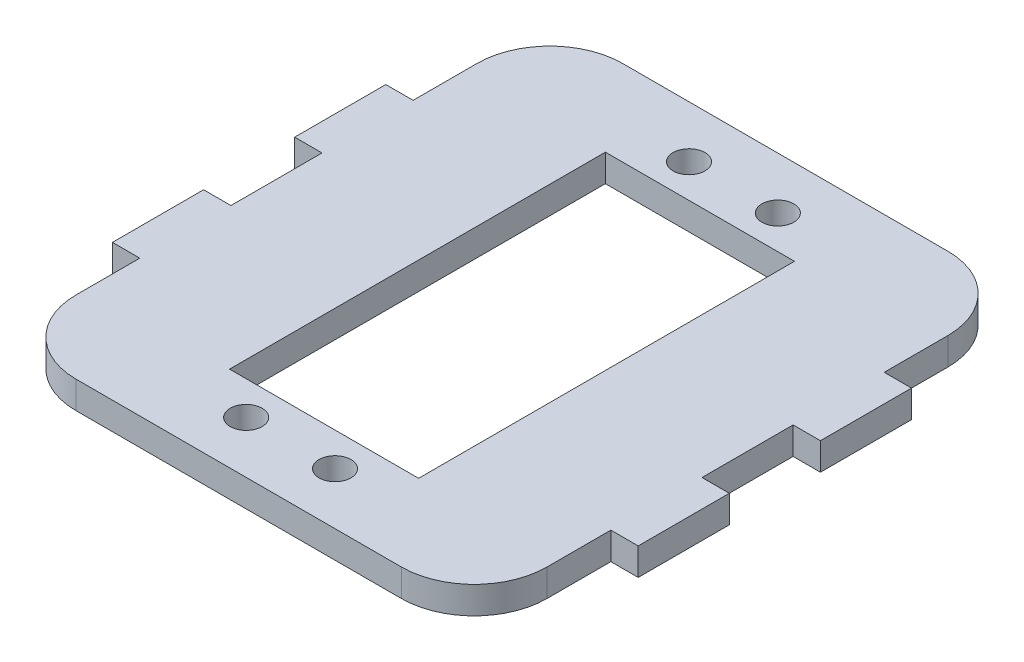
ISO-10303-21;
HEADER;
FILE_DESCRIPTION(('STEP AP214'),'2;1');
FILE_NAME('part.step','',(''),(''),'','','');
FILE_SCHEMA(('AUTOMOTIVE_DESIGN { 1 0 10303 214 1 1 1 1 }'));
ENDSEC;
DATA;
#1=APPLICATION_CONTEXT('core data for automotive mechanical design processes');
#2=APPLICATION_PROTOCOL_DEFINITION('international standard','automotive_design',2000,#1);
#3=PRODUCT_CONTEXT('',#1,'mechanical');
#4=PRODUCT('Part','Part','',(#3));
#5=PRODUCT_RELATED_PRODUCT_CATEGORY('part','',(#4));
#6=PRODUCT_DEFINITION_FORMATION('','',#4);
#7=PRODUCT_DEFINITION_CONTEXT('part definition',#1,'design');
#8=PRODUCT_DEFINITION('design','',#6,#7);
#9=PRODUCT_DEFINITION_SHAPE('','',#8);
#10=(LENGTH_UNIT() NAMED_UNIT(*) SI_UNIT(.MILLI.,.METRE.));
#11=(NAMED_UNIT(*) PLANE_ANGLE_UNIT() SI_UNIT($,.RADIAN.));
#12=(NAMED_UNIT(*) SI_UNIT($,.STERADIAN.) SOLID_ANGLE_UNIT());
#13=UNCERTAINTY_MEASURE_WITH_UNIT(LENGTH_MEASURE(1.E-05),#10,'distance_accuracy_value','');
#14=(GEOMETRIC_REPRESENTATION_CONTEXT(3) GLOBAL_UNCERTAINTY_ASSIGNED_CONTEXT((#13)) GLOBAL_UNIT_ASSIGNED_CONTEXT((#10,
#11,#12)) REPRESENTATION_CONTEXT('',''));
#15=CARTESIAN_POINT('',(0.,0.,0.));
#16=DIRECTION('',(0.,0.,1.));
#17=DIRECTION('',(1.,0.,0.));
#18=AXIS2_PLACEMENT_3D('',#15,#16,#17);
#19=CARTESIAN_POINT('',(0.,3.,0.));
#20=DIRECTION('',(0.,1.,0.));
#21=DIRECTION('',(0.,0.,1.));
#22=AXIS2_PLACEMENT_3D('',#19,#20,#21);
#23=PLANE('',#22);
#24=CARTESIAN_POINT('',(4.87500000000017,3.,-24.3));
#25=DIRECTION('',(0.,1.,0.));
#26=DIRECTION('',(0.,0.,1.));
#27=AXIS2_PLACEMENT_3D('',#24,#25,#26);
#28=CIRCLE('',#27,1.75);
#29=CARTESIAN_POINT('',(4.87500000000017,3.,-22.55));
#30=VERTEX_POINT('',#29);
#31=EDGE_CURVE('E928',#30,#30,#28,.T.);
#32=ORIENTED_EDGE('',*,*,#31,.F.);
#33=EDGE_LOOP('',(#32));
#34=FACE_BOUND('',#33,.T.);
#35=CARTESIAN_POINT('',(-4.875,3.,24.3));
#36=DIRECTION('',(0.,1.,0.));
#37=DIRECTION('',(0.,0.,1.));
#38=AXIS2_PLACEMENT_3D('',#35,#36,#37);
#39=CIRCLE('',#38,1.75);
#40=CARTESIAN_POINT('',(-4.875,3.,26.05));
#41=VERTEX_POINT('',#40);
#42=EDGE_CURVE('E265',#41,#41,#39,.T.);
#43=ORIENTED_EDGE('',*,*,#42,.F.);
#44=EDGE_LOOP('',(#43));
#45=FACE_BOUND('',#44,.T.);
#46=DIRECTION('',(1.,0.,0.));
#47=VECTOR('',#46,1.);
#48=CARTESIAN_POINT('',(25.8500000000002,3.,29.9999999999998));
#49=LINE('',#48,#47);
#50=CARTESIAN_POINT('',(-17.85,3.,30.));
#51=VERTEX_POINT('',#50);
#52=CARTESIAN_POINT('',(17.8500000000002,3.,29.9999999999998));
#53=VERTEX_POINT('',#52);
#54=EDGE_CURVE('E286',#51,#53,#49,.T.);
#55=ORIENTED_EDGE('',*,*,#54,.T.);
#56=CARTESIAN_POINT('',(17.8500000000002,3.,21.9999999999998));
#57=DIRECTION('',(0.,1.,0.));
#58=DIRECTION('',(0.,0.,1.));
#59=AXIS2_PLACEMENT_3D('',#56,#57,#58);
#60=CIRCLE('',#59,8.);
#61=CARTESIAN_POINT('',(25.8500000000002,3.,21.9999999999998));
#62=VERTEX_POINT('',#61);
#63=EDGE_CURVE('E502',#53,#62,#60,.T.);
#64=ORIENTED_EDGE('',*,*,#63,.T.);
#65=DIRECTION('',(0.,0.,-1.));
#66=VECTOR('',#65,1.);
#67=CARTESIAN_POINT('',(25.8500000000002,3.,29.9999999999998));
#68=LINE('',#67,#66);
#69=CARTESIAN_POINT('',(25.8500000000001,3.,14.9999999999998));
#70=VERTEX_POINT('',#69);
#71=EDGE_CURVE('E291',#62,#70,#68,.T.);
#72=ORIENTED_EDGE('',*,*,#71,.T.);
#73=DIRECTION('',(1.,0.,0.));
#74=VECTOR('',#73,1.);
#75=CARTESIAN_POINT('',(25.8500000000001,3.,14.9999999999998));
#76=LINE('',#75,#74);
#77=CARTESIAN_POINT('',(28.8500000000001,3.,14.9999999999998));
#78=VERTEX_POINT('',#77);
#79=EDGE_CURVE('E294',#70,#78,#76,.T.);
#80=ORIENTED_EDGE('',*,*,#79,.T.);
#81=DIRECTION('',(0.,0.,-1.));
#82=VECTOR('',#81,1.);
#83=CARTESIAN_POINT('',(28.8500000000001,3.,14.9999999999998));
#84=LINE('',#83,#82);
#85=CARTESIAN_POINT('',(28.85,3.,4.99999999999978));
#86=VERTEX_POINT('',#85);
#87=EDGE_CURVE('E297',#78,#86,#84,.T.);
#88=ORIENTED_EDGE('',*,*,#87,.T.);
#89=DIRECTION('',(-1.,0.,0.));
#90=VECTOR('',#89,1.);
#91=CARTESIAN_POINT('',(28.85,3.,4.99999999999978));
#92=LINE('',#91,#90);
#93=CARTESIAN_POINT('',(25.85,3.,4.99999999999978));
#94=VERTEX_POINT('',#93);
#95=EDGE_CURVE('E300',#86,#94,#92,.T.);
#96=ORIENTED_EDGE('',*,*,#95,.T.);
#97=DIRECTION('',(0.,0.,-1.));
#98=VECTOR('',#97,1.);
#99=CARTESIAN_POINT('',(25.85,3.,4.99999999999978));
#100=LINE('',#99,#98);
#101=CARTESIAN_POINT('',(25.85,3.,-5.00000000000022));
#102=VERTEX_POINT('',#101);
#103=EDGE_CURVE('E303',#94,#102,#100,.T.);
#104=ORIENTED_EDGE('',*,*,#103,.T.);
#105=DIRECTION('',(1.,0.,0.));
#106=VECTOR('',#105,1.);
#107=CARTESIAN_POINT('',(28.85,3.,-5.00000000000022));
#108=LINE('',#107,#106);
#109=CARTESIAN_POINT('',(28.85,3.,-5.00000000000022));
#110=VERTEX_POINT('',#109);
#111=EDGE_CURVE('E306',#102,#110,#108,.T.);
#112=ORIENTED_EDGE('',*,*,#111,.T.);
#113=DIRECTION('',(0.,0.,-1.));
#114=VECTOR('',#113,1.);
#115=CARTESIAN_POINT('',(28.8499999999999,3.,-15.0000000000002));
#116=LINE('',#115,#114);
#117=CARTESIAN_POINT('',(28.8499999999999,3.,-15.0000000000002));
#118=VERTEX_POINT('',#117);
#119=EDGE_CURVE('E309',#110,#118,#116,.T.);
#120=ORIENTED_EDGE('',*,*,#119,.T.);
#121=DIRECTION('',(-1.,0.,0.));
#122=VECTOR('',#121,1.);
#123=CARTESIAN_POINT('',(25.8499999999999,3.,-15.0000000000002));
#124=LINE('',#123,#122);
#125=CARTESIAN_POINT('',(25.8499999999999,3.,-15.0000000000002));
#126=VERTEX_POINT('',#125);
#127=EDGE_CURVE('E312',#118,#126,#124,.T.);
#128=ORIENTED_EDGE('',*,*,#127,.T.);
#129=DIRECTION('',(0.,0.,-1.));
#130=VECTOR('',#129,1.);
#131=CARTESIAN_POINT('',(25.8499999999999,3.,-15.0000000000002));
#132=LINE('',#131,#130);
#133=CARTESIAN_POINT('',(25.8499999999999,3.,-22.0000000000002));
#134=VERTEX_POINT('',#133);
#135=EDGE_CURVE('E315',#126,#134,#132,.T.);
#136=ORIENTED_EDGE('',*,*,#135,.T.);
#137=CARTESIAN_POINT('',(17.8499999999999,3.,-22.0000000000002));
#138=DIRECTION('',(0.,1.,0.));
#139=DIRECTION('',(0.,0.,1.));
#140=AXIS2_PLACEMENT_3D('',#137,#138,#139);
#141=CIRCLE('',#140,8.);
#142=CARTESIAN_POINT('',(17.8499999999998,3.,-30.0000000000002));
#143=VERTEX_POINT('',#142);
#144=EDGE_CURVE('E494',#134,#143,#141,.T.);
#145=ORIENTED_EDGE('',*,*,#144,.T.);
#146=DIRECTION('',(-1.,0.,0.));
#147=VECTOR('',#146,1.);
#148=CARTESIAN_POINT('',(25.8499999999998,3.,-30.0000000000002));
#149=LINE('',#148,#147);
#150=CARTESIAN_POINT('',(-17.85,3.,-30.));
#151=VERTEX_POINT('',#150);
#152=EDGE_CURVE('E319',#143,#151,#149,.T.);
#153=ORIENTED_EDGE('',*,*,#152,.T.);
#154=CARTESIAN_POINT('',(-17.85,3.,-22.));
#155=DIRECTION('',(0.,1.,0.));
#156=DIRECTION('',(0.,0.,1.));
#157=AXIS2_PLACEMENT_3D('',#154,#155,#156);
#158=CIRCLE('',#157,8.);
#159=CARTESIAN_POINT('',(-25.85,3.,-22.));
#160=VERTEX_POINT('',#159);
#161=EDGE_CURVE('E55',#151,#160,#158,.T.);
#162=ORIENTED_EDGE('',*,*,#161,.T.);
#163=DIRECTION('',(0.,0.,1.));
#164=VECTOR('',#163,1.);
#165=CARTESIAN_POINT('',(-25.85,3.,-15.));
#166=LINE('',#165,#164);
#167=CARTESIAN_POINT('',(-25.85,3.,-15.));
#168=VERTEX_POINT('',#167);
#169=EDGE_CURVE('E322',#160,#168,#166,.T.);
#170=ORIENTED_EDGE('',*,*,#169,.T.);
#171=DIRECTION('',(-1.,0.,0.));
#172=VECTOR('',#171,1.);
#173=CARTESIAN_POINT('',(-25.85,3.,-15.));
#174=LINE('',#173,#172);
#175=CARTESIAN_POINT('',(-28.85,3.,-15.));
#176=VERTEX_POINT('',#175);
#177=EDGE_CURVE('E325',#168,#176,#174,.T.);
#178=ORIENTED_EDGE('',*,*,#177,.T.);
#179=DIRECTION('',(0.,0.,1.));
#180=VECTOR('',#179,1.);
#181=CARTESIAN_POINT('',(-28.85,3.,-15.));
#182=LINE('',#181,#180);
#183=CARTESIAN_POINT('',(-28.85,3.,-5.));
#184=VERTEX_POINT('',#183);
#185=EDGE_CURVE('E328',#176,#184,#182,.T.);
#186=ORIENTED_EDGE('',*,*,#185,.T.);
#187=DIRECTION('',(1.,0.,0.));
#188=VECTOR('',#187,1.);
#189=CARTESIAN_POINT('',(-28.85,3.,-5.));
#190=LINE('',#189,#188);
#191=CARTESIAN_POINT('',(-25.85,3.,-5.));
#192=VERTEX_POINT('',#191);
#193=EDGE_CURVE('E331',#184,#192,#190,.T.);
#194=ORIENTED_EDGE('',*,*,#193,.T.);
#195=DIRECTION('',(0.,0.,1.));
#196=VECTOR('',#195,1.);
#197=CARTESIAN_POINT('',(-25.85,3.,5.));
#198=LINE('',#197,#196);
#199=CARTESIAN_POINT('',(-25.85,3.,5.));
#200=VERTEX_POINT('',#199);
#201=EDGE_CURVE('E334',#192,#200,#198,.T.);
#202=ORIENTED_EDGE('',*,*,#201,.T.);
#203=DIRECTION('',(-1.,0.,0.));
#204=VECTOR('',#203,1.);
#205=CARTESIAN_POINT('',(-28.85,3.,5.));
#206=LINE('',#205,#204);
#207=CARTESIAN_POINT('',(-28.85,3.,5.));
#208=VERTEX_POINT('',#207);
#209=EDGE_CURVE('E337',#200,#208,#206,.T.);
#210=ORIENTED_EDGE('',*,*,#209,.T.);
#211=DIRECTION('',(0.,0.,1.));
#212=VECTOR('',#211,1.);
#213=CARTESIAN_POINT('',(-28.85,3.,15.));
#214=LINE('',#213,#212);
#215=CARTESIAN_POINT('',(-28.85,3.,15.));
#216=VERTEX_POINT('',#215);
#217=EDGE_CURVE('E340',#208,#216,#214,.T.);
#218=ORIENTED_EDGE('',*,*,#217,.T.);
#219=DIRECTION('',(1.,0.,0.));
#220=VECTOR('',#219,1.);
#221=CARTESIAN_POINT('',(-25.85,3.,15.));
#222=LINE('',#221,#220);
#223=CARTESIAN_POINT('',(-25.85,3.,15.));
#224=VERTEX_POINT('',#223);
#225=EDGE_CURVE('E343',#216,#224,#222,.T.);
#226=ORIENTED_EDGE('',*,*,#225,.T.);
#227=DIRECTION('',(0.,0.,1.));
#228=VECTOR('',#227,1.);
#229=CARTESIAN_POINT('',(-25.85,3.,30.));
#230=LINE('',#229,#228);
#231=CARTESIAN_POINT('',(-25.85,3.,22.));
#232=VERTEX_POINT('',#231);
#233=EDGE_CURVE('E282',#224,#232,#230,.T.);
#234=ORIENTED_EDGE('',*,*,#233,.T.);
#235=CARTESIAN_POINT('',(-17.85,3.,22.));
#236=DIRECTION('',(0.,1.,0.));
#237=DIRECTION('',(0.,0.,1.));
#238=AXIS2_PLACEMENT_3D('',#235,#236,#237);
#239=CIRCLE('',#238,8.);
#240=EDGE_CURVE('E499',#232,#51,#239,.T.);
#241=ORIENTED_EDGE('',*,*,#240,.T.);
#242=EDGE_LOOP('',(#55,#64,#72,#80,#88,#96,#104,#112,#120,#128,#136,#145,#153,#162,#170,#178,
#186,#194,#202,#210,#218,#226,#234,#241));
#243=FACE_BOUND('',#242,.T.);
#244=DIRECTION('',(-1.,0.,0.));
#245=VECTOR('',#244,1.);
#246=CARTESIAN_POINT('',(-10.375,3.,-20.625));
#247=LINE('',#246,#245);
#248=CARTESIAN_POINT('',(10.3749999999999,3.,-20.6250000000001));
#249=VERTEX_POINT('',#248);
#250=CARTESIAN_POINT('',(-10.375,3.,-20.625));
#251=VERTEX_POINT('',#250);
#252=EDGE_CURVE('E237',#249,#251,#247,.T.);
#253=ORIENTED_EDGE('',*,*,#252,.F.);
#254=DIRECTION('',(0.,0.,-1.));
#255=VECTOR('',#254,1.);
#256=CARTESIAN_POINT('',(10.3749999999999,3.,-20.6250000000001));
#257=LINE('',#256,#255);
#258=CARTESIAN_POINT('',(10.3750000000001,3.,20.6249999999999));
#259=VERTEX_POINT('',#258);
#260=EDGE_CURVE('E226',#259,#249,#257,.T.);
#261=ORIENTED_EDGE('',*,*,#260,.F.);
#262=DIRECTION('',(1.,0.,0.));
#263=VECTOR('',#262,1.);
#264=CARTESIAN_POINT('',(-10.375,3.,20.625));
#265=LINE('',#264,#263);
#266=CARTESIAN_POINT('',(-10.375,3.,20.625));
#267=VERTEX_POINT('',#266);
#268=EDGE_CURVE('E256',#267,#259,#265,.T.);
#269=ORIENTED_EDGE('',*,*,#268,.F.);
#270=DIRECTION('',(0.,0.,1.));
#271=VECTOR('',#270,1.);
#272=CARTESIAN_POINT('',(-10.375,3.,-20.625));
#273=LINE('',#272,#271);
#274=EDGE_CURVE('E252',#251,#267,#273,.T.);
#275=ORIENTED_EDGE('',*,*,#274,.F.);
#276=EDGE_LOOP('',(#253,#261,#269,#275));
#277=FACE_BOUND('',#276,.T.);
#278=CARTESIAN_POINT('',(4.87500000000017,3.,24.3));
#279=DIRECTION('',(0.,1.,0.));
#280=DIRECTION('',(0.,0.,-1.));
#281=AXIS2_PLACEMENT_3D('',#278,#279,#280);
#282=CIRCLE('',#281,1.75);
#283=CARTESIAN_POINT('',(4.87500000000017,3.,22.55));
#284=VERTEX_POINT('',#283);
#285=EDGE_CURVE('E936',#284,#284,#282,.T.);
#286=ORIENTED_EDGE('',*,*,#285,.F.);
#287=EDGE_LOOP('',(#286));
#288=FACE_BOUND('',#287,.T.);
#289=CARTESIAN_POINT('',(-4.875,3.,-24.3));
#290=DIRECTION('',(0.,1.,0.));
#291=DIRECTION('',(0.,0.,-1.));
#292=AXIS2_PLACEMENT_3D('',#289,#290,#291);
#293=CIRCLE('',#292,1.75);
#294=CARTESIAN_POINT('',(-4.875,3.,-26.05));
#295=VERTEX_POINT('',#294);
#296=EDGE_CURVE('E917',#295,#295,#293,.T.);
#297=ORIENTED_EDGE('',*,*,#296,.F.);
#298=EDGE_LOOP('',(#297));
#299=FACE_BOUND('',#298,.T.);
#300=ADVANCED_FACE('F39',(#34,#45,#243,#277,#288,#299),#23,.T.);
#301=CARTESIAN_POINT('',(0.,0.,0.));
#302=DIRECTION('',(0.,1.,0.));
#303=DIRECTION('',(0.,0.,1.));
#304=AXIS2_PLACEMENT_3D('',#301,#302,#303);
#305=PLANE('',#304);
#306=DIRECTION('',(0.,0.,-1.));
#307=VECTOR('',#306,1.);
#308=CARTESIAN_POINT('',(25.8500000000002,0.,29.9999999999998));
#309=LINE('',#308,#307);
#310=CARTESIAN_POINT('',(25.8500000000002,0.,21.9999999999998));
#311=VERTEX_POINT('',#310);
#312=CARTESIAN_POINT('',(25.8500000000001,0.,14.9999999999998));
#313=VERTEX_POINT('',#312);
#314=EDGE_CURVE('E354',#311,#313,#309,.T.);
#315=ORIENTED_EDGE('',*,*,#314,.F.);
#316=CARTESIAN_POINT('',(17.8500000000002,0.,21.9999999999998));
#317=DIRECTION('',(0.,1.,0.));
#318=DIRECTION('',(0.,0.,1.));
#319=AXIS2_PLACEMENT_3D('',#316,#317,#318);
#320=CIRCLE('',#319,8.);
#321=CARTESIAN_POINT('',(17.8500000000002,0.,29.9999999999998));
#322=VERTEX_POINT('',#321);
#323=EDGE_CURVE('E484',#311,#322,#320,.F.);
#324=ORIENTED_EDGE('',*,*,#323,.T.);
#325=DIRECTION('',(1.,0.,0.));
#326=VECTOR('',#325,1.);
#327=CARTESIAN_POINT('',(25.8500000000002,0.,29.9999999999998));
#328=LINE('',#327,#326);
#329=CARTESIAN_POINT('',(-17.85,0.,30.));
#330=VERTEX_POINT('',#329);
#331=EDGE_CURVE('E350',#330,#322,#328,.T.);
#332=ORIENTED_EDGE('',*,*,#331,.F.);
#333=CARTESIAN_POINT('',(-17.85,0.,22.));
#334=DIRECTION('',(0.,1.,0.));
#335=DIRECTION('',(0.,0.,1.));
#336=AXIS2_PLACEMENT_3D('',#333,#334,#335);
#337=CIRCLE('',#336,8.);
#338=CARTESIAN_POINT('',(-25.85,0.,22.));
#339=VERTEX_POINT('',#338);
#340=EDGE_CURVE('E481',#330,#339,#337,.F.);
#341=ORIENTED_EDGE('',*,*,#340,.T.);
#342=DIRECTION('',(0.,0.,1.));
#343=VECTOR('',#342,1.);
#344=CARTESIAN_POINT('',(-25.85,0.,30.));
#345=LINE('',#344,#343);
#346=CARTESIAN_POINT('',(-25.85,0.,15.));
#347=VERTEX_POINT('',#346);
#348=EDGE_CURVE('E246',#347,#339,#345,.T.);
#349=ORIENTED_EDGE('',*,*,#348,.F.);
#350=DIRECTION('',(1.,0.,0.));
#351=VECTOR('',#350,1.);
#352=CARTESIAN_POINT('',(-25.85,0.,15.));
#353=LINE('',#352,#351);
#354=CARTESIAN_POINT('',(-28.85,0.,15.));
#355=VERTEX_POINT('',#354);
#356=EDGE_CURVE('E287',#355,#347,#353,.T.);
#357=ORIENTED_EDGE('',*,*,#356,.F.);
#358=DIRECTION('',(0.,0.,1.));
#359=VECTOR('',#358,1.);
#360=CARTESIAN_POINT('',(-28.85,0.,15.));
#361=LINE('',#360,#359);
#362=CARTESIAN_POINT('',(-28.85,0.,5.));
#363=VERTEX_POINT('',#362);
#364=EDGE_CURVE('E403',#363,#355,#361,.T.);
#365=ORIENTED_EDGE('',*,*,#364,.F.);
#366=DIRECTION('',(-1.,0.,0.));
#367=VECTOR('',#366,1.);
#368=CARTESIAN_POINT('',(-28.85,0.,5.));
#369=LINE('',#368,#367);
#370=CARTESIAN_POINT('',(-25.85,0.,5.));
#371=VERTEX_POINT('',#370);
#372=EDGE_CURVE('E400',#371,#363,#369,.T.);
#373=ORIENTED_EDGE('',*,*,#372,.F.);
#374=DIRECTION('',(0.,0.,1.));
#375=VECTOR('',#374,1.);
#376=CARTESIAN_POINT('',(-25.85,0.,5.));
#377=LINE('',#376,#375);
#378=CARTESIAN_POINT('',(-25.85,0.,-5.));
#379=VERTEX_POINT('',#378);
#380=EDGE_CURVE('E397',#379,#371,#377,.T.);
#381=ORIENTED_EDGE('',*,*,#380,.F.);
#382=DIRECTION('',(1.,0.,0.));
#383=VECTOR('',#382,1.);
#384=CARTESIAN_POINT('',(-28.85,0.,-5.));
#385=LINE('',#384,#383);
#386=CARTESIAN_POINT('',(-28.85,0.,-5.));
#387=VERTEX_POINT('',#386);
#388=EDGE_CURVE('E394',#387,#379,#385,.T.);
#389=ORIENTED_EDGE('',*,*,#388,.F.);
#390=DIRECTION('',(0.,0.,1.));
#391=VECTOR('',#390,1.);
#392=CARTESIAN_POINT('',(-28.85,0.,-15.));
#393=LINE('',#392,#391);
#394=CARTESIAN_POINT('',(-28.85,0.,-15.));
#395=VERTEX_POINT('',#394);
#396=EDGE_CURVE('E391',#395,#387,#393,.T.);
#397=ORIENTED_EDGE('',*,*,#396,.F.);
#398=DIRECTION('',(-1.,0.,0.));
#399=VECTOR('',#398,1.);
#400=CARTESIAN_POINT('',(-25.85,0.,-15.));
#401=LINE('',#400,#399);
#402=CARTESIAN_POINT('',(-25.85,0.,-15.));
#403=VERTEX_POINT('',#402);
#404=EDGE_CURVE('E388',#403,#395,#401,.T.);
#405=ORIENTED_EDGE('',*,*,#404,.F.);
#406=DIRECTION('',(0.,0.,1.));
#407=VECTOR('',#406,1.);
#408=CARTESIAN_POINT('',(-25.85,0.,-15.));
#409=LINE('',#408,#407);
#410=CARTESIAN_POINT('',(-25.85,0.,-22.));
#411=VERTEX_POINT('',#410);
#412=EDGE_CURVE('E385',#411,#403,#409,.T.);
#413=ORIENTED_EDGE('',*,*,#412,.F.);
#414=CARTESIAN_POINT('',(-17.85,0.,-22.));
#415=DIRECTION('',(0.,1.,0.));
#416=DIRECTION('',(0.,0.,1.));
#417=AXIS2_PLACEMENT_3D('',#414,#415,#416);
#418=CIRCLE('',#417,8.);
#419=CARTESIAN_POINT('',(-17.85,0.,-30.));
#420=VERTEX_POINT('',#419);
#421=EDGE_CURVE('E478',#411,#420,#418,.F.);
#422=ORIENTED_EDGE('',*,*,#421,.T.);
#423=DIRECTION('',(-1.,0.,0.));
#424=VECTOR('',#423,1.);
#425=CARTESIAN_POINT('',(25.8499999999998,0.,-30.0000000000002));
#426=LINE('',#425,#424);
#427=CARTESIAN_POINT('',(17.8499999999998,0.,-30.0000000000002));
#428=VERTEX_POINT('',#427);
#429=EDGE_CURVE('E382',#428,#420,#426,.T.);
#430=ORIENTED_EDGE('',*,*,#429,.F.);
#431=CARTESIAN_POINT('',(17.8499999999999,0.,-22.0000000000002));
#432=DIRECTION('',(0.,1.,0.));
#433=DIRECTION('',(0.,0.,1.));
#434=AXIS2_PLACEMENT_3D('',#431,#432,#433);
#435=CIRCLE('',#434,8.);
#436=CARTESIAN_POINT('',(25.8499999999999,0.,-22.0000000000002));
#437=VERTEX_POINT('',#436);
#438=EDGE_CURVE('E475',#428,#437,#435,.F.);
#439=ORIENTED_EDGE('',*,*,#438,.T.);
#440=DIRECTION('',(0.,0.,-1.));
#441=VECTOR('',#440,1.);
#442=CARTESIAN_POINT('',(25.8499999999999,0.,-15.0000000000002));
#443=LINE('',#442,#441);
#444=CARTESIAN_POINT('',(25.8499999999999,0.,-15.0000000000002));
#445=VERTEX_POINT('',#444);
#446=EDGE_CURVE('E378',#445,#437,#443,.T.);
#447=ORIENTED_EDGE('',*,*,#446,.F.);
#448=DIRECTION('',(-1.,0.,0.));
#449=VECTOR('',#448,1.);
#450=CARTESIAN_POINT('',(25.8499999999999,0.,-15.0000000000002));
#451=LINE('',#450,#449);
#452=CARTESIAN_POINT('',(28.8499999999999,0.,-15.0000000000002));
#453=VERTEX_POINT('',#452);
#454=EDGE_CURVE('E375',#453,#445,#451,.T.);
#455=ORIENTED_EDGE('',*,*,#454,.F.);
#456=DIRECTION('',(0.,0.,-1.));
#457=VECTOR('',#456,1.);
#458=CARTESIAN_POINT('',(28.8499999999999,0.,-15.0000000000002));
#459=LINE('',#458,#457);
#460=CARTESIAN_POINT('',(28.85,0.,-5.00000000000022));
#461=VERTEX_POINT('',#460);
#462=EDGE_CURVE('E372',#461,#453,#459,.T.);
#463=ORIENTED_EDGE('',*,*,#462,.F.);
#464=DIRECTION('',(1.,0.,0.));
#465=VECTOR('',#464,1.);
#466=CARTESIAN_POINT('',(28.85,0.,-5.00000000000022));
#467=LINE('',#466,#465);
#468=CARTESIAN_POINT('',(25.85,0.,-5.00000000000022));
#469=VERTEX_POINT('',#468);
#470=EDGE_CURVE('E369',#469,#461,#467,.T.);
#471=ORIENTED_EDGE('',*,*,#470,.F.);
#472=DIRECTION('',(0.,0.,-1.));
#473=VECTOR('',#472,1.);
#474=CARTESIAN_POINT('',(25.85,0.,4.99999999999978));
#475=LINE('',#474,#473);
#476=CARTESIAN_POINT('',(25.85,0.,4.99999999999978));
#477=VERTEX_POINT('',#476);
#478=EDGE_CURVE('E366',#477,#469,#475,.T.);
#479=ORIENTED_EDGE('',*,*,#478,.F.);
#480=DIRECTION('',(-1.,0.,0.));
#481=VECTOR('',#480,1.);
#482=CARTESIAN_POINT('',(28.85,0.,4.99999999999978));
#483=LINE('',#482,#481);
#484=CARTESIAN_POINT('',(28.85,0.,4.99999999999978));
#485=VERTEX_POINT('',#484);
#486=EDGE_CURVE('E363',#485,#477,#483,.T.);
#487=ORIENTED_EDGE('',*,*,#486,.F.);
#488=DIRECTION('',(0.,0.,-1.));
#489=VECTOR('',#488,1.);
#490=CARTESIAN_POINT('',(28.8500000000001,0.,14.9999999999998));
#491=LINE('',#490,#489);
#492=CARTESIAN_POINT('',(28.8500000000001,0.,14.9999999999998));
#493=VERTEX_POINT('',#492);
#494=EDGE_CURVE('E360',#493,#485,#491,.T.);
#495=ORIENTED_EDGE('',*,*,#494,.F.);
#496=DIRECTION('',(1.,0.,0.));
#497=VECTOR('',#496,1.);
#498=CARTESIAN_POINT('',(25.8500000000001,0.,14.9999999999998));
#499=LINE('',#498,#497);
#500=EDGE_CURVE('E357',#313,#493,#499,.T.);
#501=ORIENTED_EDGE('',*,*,#500,.F.);
#502=EDGE_LOOP('',(#315,#324,#332,#341,#349,#357,#365,#373,#381,#389,#397,#405,#413,#422,#430,
#439,#447,#455,#463,#471,#479,#487,#495,#501));
#503=FACE_BOUND('',#502,.T.);
#504=DIRECTION('',(0.,0.,-1.));
#505=VECTOR('',#504,1.);
#506=CARTESIAN_POINT('',(10.3749999999999,0.,-20.6250000000001));
#507=LINE('',#506,#505);
#508=CARTESIAN_POINT('',(10.3750000000001,0.,20.6249999999999));
#509=VERTEX_POINT('',#508);
#510=CARTESIAN_POINT('',(10.3749999999999,0.,-20.6250000000001));
#511=VERTEX_POINT('',#510);
#512=EDGE_CURVE('E262',#509,#511,#507,.T.);
#513=ORIENTED_EDGE('',*,*,#512,.T.);
#514=DIRECTION('',(-1.,0.,0.));
#515=VECTOR('',#514,1.);
#516=CARTESIAN_POINT('',(-10.375,0.,-20.625));
#517=LINE('',#516,#515);
#518=CARTESIAN_POINT('',(-10.375,0.,-20.625));
#519=VERTEX_POINT('',#518);
#520=EDGE_CURVE('E244',#511,#519,#517,.T.);
#521=ORIENTED_EDGE('',*,*,#520,.T.);
#522=DIRECTION('',(0.,0.,1.));
#523=VECTOR('',#522,1.);
#524=CARTESIAN_POINT('',(-10.375,0.,-20.625));
#525=LINE('',#524,#523);
#526=CARTESIAN_POINT('',(-10.375,0.,20.625));
#527=VERTEX_POINT('',#526);
#528=EDGE_CURVE('E268',#519,#527,#525,.T.);
#529=ORIENTED_EDGE('',*,*,#528,.T.);
#530=DIRECTION('',(1.,0.,0.));
#531=VECTOR('',#530,1.);
#532=CARTESIAN_POINT('',(-10.375,0.,20.625));
#533=LINE('',#532,#531);
#534=EDGE_CURVE('E238',#527,#509,#533,.T.);
#535=ORIENTED_EDGE('',*,*,#534,.T.);
#536=EDGE_LOOP('',(#513,#521,#529,#535));
#537=FACE_BOUND('',#536,.T.);
#538=CARTESIAN_POINT('',(-4.875,0.,24.3));
#539=DIRECTION('',(0.,1.,0.));
#540=DIRECTION('',(0.,0.,1.));
#541=AXIS2_PLACEMENT_3D('',#538,#539,#540);
#542=CIRCLE('',#541,1.75);
#543=CARTESIAN_POINT('',(-4.875,0.,26.05));
#544=VERTEX_POINT('',#543);
#545=EDGE_CURVE('E940',#544,#544,#542,.T.);
#546=ORIENTED_EDGE('',*,*,#545,.T.);
#547=EDGE_LOOP('',(#546));
#548=FACE_BOUND('',#547,.T.);
#549=CARTESIAN_POINT('',(4.87500000000017,0.,24.3));
#550=DIRECTION('',(0.,1.,0.));
#551=DIRECTION('',(0.,0.,-1.));
#552=AXIS2_PLACEMENT_3D('',#549,#550,#551);
#553=CIRCLE('',#552,1.75);
#554=CARTESIAN_POINT('',(4.87500000000017,0.,22.55));
#555=VERTEX_POINT('',#554);
#556=EDGE_CURVE('E932',#555,#555,#553,.T.);
#557=ORIENTED_EDGE('',*,*,#556,.T.);
#558=EDGE_LOOP('',(#557));
#559=FACE_BOUND('',#558,.T.);
#560=CARTESIAN_POINT('',(4.87500000000017,0.,-24.3));
#561=DIRECTION('',(0.,1.,0.));
#562=DIRECTION('',(0.,0.,1.));
#563=AXIS2_PLACEMENT_3D('',#560,#561,#562);
#564=CIRCLE('',#563,1.75);
#565=CARTESIAN_POINT('',(4.87500000000017,0.,-22.55));
#566=VERTEX_POINT('',#565);
#567=EDGE_CURVE('E925',#566,#566,#564,.T.);
#568=ORIENTED_EDGE('',*,*,#567,.T.);
#569=EDGE_LOOP('',(#568));
#570=FACE_BOUND('',#569,.T.);
#571=CARTESIAN_POINT('',(-4.875,0.,-24.3));
#572=DIRECTION('',(0.,1.,0.));
#573=DIRECTION('',(0.,0.,-1.));
#574=AXIS2_PLACEMENT_3D('',#571,#572,#573);
#575=CIRCLE('',#574,1.75);
#576=CARTESIAN_POINT('',(-4.875,0.,-26.05));
#577=VERTEX_POINT('',#576);
#578=EDGE_CURVE('E920',#577,#577,#575,.T.);
#579=ORIENTED_EDGE('',*,*,#578,.T.);
#580=EDGE_LOOP('',(#579));
#581=FACE_BOUND('',#580,.T.);
#582=ADVANCED_FACE('F523',(#503,#537,#548,#559,#570,#581),#305,.F.);
#583=CARTESIAN_POINT('',(-25.85,3.,30.));
#584=DIRECTION('',(1.,0.,0.));
#585=DIRECTION('',(0.,0.,-1.));
#586=AXIS2_PLACEMENT_3D('',#583,#584,#585);
#587=PLANE('',#586);
#588=ORIENTED_EDGE('',*,*,#348,.T.);
#589=DIRECTION('',(0.,-1.,0.));
#590=VECTOR('',#589,1.);
#591=CARTESIAN_POINT('',(-25.85,3.,22.));
#592=LINE('',#591,#590);
#593=EDGE_CURVE('E505',#339,#232,#592,.F.);
#594=ORIENTED_EDGE('',*,*,#593,.T.);
#595=ORIENTED_EDGE('',*,*,#233,.F.);
#596=DIRECTION('',(0.,-1.,0.));
#597=VECTOR('',#596,1.);
#598=CARTESIAN_POINT('',(-25.85,3.,15.));
#599=LINE('',#598,#597);
#600=EDGE_CURVE('E346',#224,#347,#599,.T.);
#601=ORIENTED_EDGE('',*,*,#600,.T.);
#602=EDGE_LOOP('',(#588,#594,#595,#601));
#603=FACE_BOUND('',#602,.T.);
#604=ADVANCED_FACE('F572',(#603),#587,.F.);
#605=CARTESIAN_POINT('',(25.8500000000002,3.,29.9999999999998));
#606=DIRECTION('',(0.,0.,-1.));
#607=DIRECTION('',(-1.,0.,0.));
#608=AXIS2_PLACEMENT_3D('',#605,#606,#607);
#609=PLANE('',#608);
#610=ORIENTED_EDGE('',*,*,#331,.T.);
#611=DIRECTION('',(0.,-1.,0.));
#612=VECTOR('',#611,1.);
#613=CARTESIAN_POINT('',(17.8500000000002,3.,29.9999999999998));
#614=LINE('',#613,#612);
#615=EDGE_CURVE('E491',#322,#53,#614,.F.);
#616=ORIENTED_EDGE('',*,*,#615,.T.);
#617=ORIENTED_EDGE('',*,*,#54,.F.);
#618=DIRECTION('',(0.,-1.,0.));
#619=VECTOR('',#618,1.);
#620=CARTESIAN_POINT('',(-17.85,3.,30.));
#621=LINE('',#620,#619);
#622=EDGE_CURVE('E487',#51,#330,#621,.T.);
#623=ORIENTED_EDGE('',*,*,#622,.T.);
#624=EDGE_LOOP('',(#610,#616,#617,#623));
#625=FACE_BOUND('',#624,.T.);
#626=ADVANCED_FACE('F580',(#625),#609,.F.);
#627=CARTESIAN_POINT('',(25.8500000000002,3.,29.9999999999998));
#628=DIRECTION('',(-1.,0.,0.));
#629=DIRECTION('',(0.,0.,1.));
#630=AXIS2_PLACEMENT_3D('',#627,#628,#629);
#631=PLANE('',#630);
#632=ORIENTED_EDGE('',*,*,#71,.F.);
#633=DIRECTION('',(0.,-1.,0.));
#634=VECTOR('',#633,1.);
#635=CARTESIAN_POINT('',(25.8500000000002,3.,21.9999999999998));
#636=LINE('',#635,#634);
#637=EDGE_CURVE('E471',#62,#311,#636,.T.);
#638=ORIENTED_EDGE('',*,*,#637,.T.);
#639=ORIENTED_EDGE('',*,*,#314,.T.);
#640=DIRECTION('',(0.,-1.,0.));
#641=VECTOR('',#640,1.);
#642=CARTESIAN_POINT('',(25.8500000000001,3.,14.9999999999998));
#643=LINE('',#642,#641);
#644=EDGE_CURVE('E467',#70,#313,#643,.T.);
#645=ORIENTED_EDGE('',*,*,#644,.F.);
#646=EDGE_LOOP('',(#632,#638,#639,#645));
#647=FACE_BOUND('',#646,.T.);
#648=ADVANCED_FACE('F589',(#647),#631,.F.);
#649=CARTESIAN_POINT('',(25.8500000000001,3.,14.9999999999998));
#650=DIRECTION('',(0.,0.,-1.));
#651=DIRECTION('',(-1.,0.,0.));
#652=AXIS2_PLACEMENT_3D('',#649,#650,#651);
#653=PLANE('',#652);
#654=ORIENTED_EDGE('',*,*,#500,.T.);
#655=DIRECTION('',(0.,-1.,0.));
#656=VECTOR('',#655,1.);
#657=CARTESIAN_POINT('',(28.8500000000001,3.,14.9999999999998));
#658=LINE('',#657,#656);
#659=EDGE_CURVE('E463',#78,#493,#658,.T.);
#660=ORIENTED_EDGE('',*,*,#659,.F.);
#661=ORIENTED_EDGE('',*,*,#79,.F.);
#662=ORIENTED_EDGE('',*,*,#644,.T.);
#663=EDGE_LOOP('',(#654,#660,#661,#662));
#664=FACE_BOUND('',#663,.T.);
#665=ADVANCED_FACE('F594',(#664),#653,.F.);
#666=CARTESIAN_POINT('',(28.8500000000001,3.,14.9999999999998));
#667=DIRECTION('',(-1.,0.,0.));
#668=DIRECTION('',(0.,0.,1.));
#669=AXIS2_PLACEMENT_3D('',#666,#667,#668);
#670=PLANE('',#669);
#671=ORIENTED_EDGE('',*,*,#494,.T.);
#672=DIRECTION('',(0.,-1.,0.));
#673=VECTOR('',#672,1.);
#674=CARTESIAN_POINT('',(28.85,3.,4.99999999999978));
#675=LINE('',#674,#673);
#676=EDGE_CURVE('E459',#86,#485,#675,.T.);
#677=ORIENTED_EDGE('',*,*,#676,.F.);
#678=ORIENTED_EDGE('',*,*,#87,.F.);
#679=ORIENTED_EDGE('',*,*,#659,.T.);
#680=EDGE_LOOP('',(#671,#677,#678,#679));
#681=FACE_BOUND('',#680,.T.);
#682=ADVANCED_FACE('F600',(#681),#670,.F.);
#683=CARTESIAN_POINT('',(28.85,3.,4.99999999999978));
#684=DIRECTION('',(0.,0.,1.));
#685=DIRECTION('',(1.,0.,0.));
#686=AXIS2_PLACEMENT_3D('',#683,#684,#685);
#687=PLANE('',#686);
#688=ORIENTED_EDGE('',*,*,#486,.T.);
#689=DIRECTION('',(0.,-1.,0.));
#690=VECTOR('',#689,1.);
#691=CARTESIAN_POINT('',(25.85,3.,4.99999999999978));
#692=LINE('',#691,#690);
#693=EDGE_CURVE('E455',#94,#477,#692,.T.);
#694=ORIENTED_EDGE('',*,*,#693,.F.);
#695=ORIENTED_EDGE('',*,*,#95,.F.);
#696=ORIENTED_EDGE('',*,*,#676,.T.);
#697=EDGE_LOOP('',(#688,#694,#695,#696));
#698=FACE_BOUND('',#697,.T.);
#699=ADVANCED_FACE('F604',(#698),#687,.F.);
#700=CARTESIAN_POINT('',(25.85,3.,4.99999999999978));
#701=DIRECTION('',(-1.,0.,0.));
#702=DIRECTION('',(0.,0.,1.));
#703=AXIS2_PLACEMENT_3D('',#700,#701,#702);
#704=PLANE('',#703);
#705=ORIENTED_EDGE('',*,*,#478,.T.);
#706=DIRECTION('',(0.,-1.,0.));
#707=VECTOR('',#706,1.);
#708=CARTESIAN_POINT('',(25.85,3.,-5.00000000000022));
#709=LINE('',#708,#707);
#710=EDGE_CURVE('E451',#102,#469,#709,.T.);
#711=ORIENTED_EDGE('',*,*,#710,.F.);
#712=ORIENTED_EDGE('',*,*,#103,.F.);
#713=ORIENTED_EDGE('',*,*,#693,.T.);
#714=EDGE_LOOP('',(#705,#711,#712,#713));
#715=FACE_BOUND('',#714,.T.);
#716=ADVANCED_FACE('F609',(#715),#704,.F.);
#717=CARTESIAN_POINT('',(28.85,3.,-5.00000000000022));
#718=DIRECTION('',(0.,0.,-1.));
#719=DIRECTION('',(-1.,0.,0.));
#720=AXIS2_PLACEMENT_3D('',#717,#718,#719);
#721=PLANE('',#720);
#722=ORIENTED_EDGE('',*,*,#470,.T.);
#723=DIRECTION('',(0.,-1.,0.));
#724=VECTOR('',#723,1.);
#725=CARTESIAN_POINT('',(28.85,3.,-5.00000000000022));
#726=LINE('',#725,#724);
#727=EDGE_CURVE('E447',#110,#461,#726,.T.);
#728=ORIENTED_EDGE('',*,*,#727,.F.);
#729=ORIENTED_EDGE('',*,*,#111,.F.);
#730=ORIENTED_EDGE('',*,*,#710,.T.);
#731=EDGE_LOOP('',(#722,#728,#729,#730));
#732=FACE_BOUND('',#731,.T.);
#733=ADVANCED_FACE('F615',(#732),#721,.F.);
#734=CARTESIAN_POINT('',(28.8499999999999,3.,-15.0000000000002));
#735=DIRECTION('',(-1.,0.,0.));
#736=DIRECTION('',(0.,0.,1.));
#737=AXIS2_PLACEMENT_3D('',#734,#735,#736);
#738=PLANE('',#737);
#739=ORIENTED_EDGE('',*,*,#462,.T.);
#740=DIRECTION('',(0.,-1.,0.));
#741=VECTOR('',#740,1.);
#742=CARTESIAN_POINT('',(28.8499999999999,3.,-15.0000000000002));
#743=LINE('',#742,#741);
#744=EDGE_CURVE('E443',#118,#453,#743,.T.);
#745=ORIENTED_EDGE('',*,*,#744,.F.);
#746=ORIENTED_EDGE('',*,*,#119,.F.);
#747=ORIENTED_EDGE('',*,*,#727,.T.);
#748=EDGE_LOOP('',(#739,#745,#746,#747));
#749=FACE_BOUND('',#748,.T.);
#750=ADVANCED_FACE('F619',(#749),#738,.F.);
#751=CARTESIAN_POINT('',(25.8499999999999,3.,-15.0000000000002));
#752=DIRECTION('',(0.,0.,1.));
#753=DIRECTION('',(1.,0.,0.));
#754=AXIS2_PLACEMENT_3D('',#751,#752,#753);
#755=PLANE('',#754);
#756=ORIENTED_EDGE('',*,*,#454,.T.);
#757=DIRECTION('',(0.,-1.,0.));
#758=VECTOR('',#757,1.);
#759=CARTESIAN_POINT('',(25.8499999999999,3.,-15.0000000000002));
#760=LINE('',#759,#758);
#761=EDGE_CURVE('E439',#126,#445,#760,.T.);
#762=ORIENTED_EDGE('',*,*,#761,.F.);
#763=ORIENTED_EDGE('',*,*,#127,.F.);
#764=ORIENTED_EDGE('',*,*,#744,.T.);
#765=EDGE_LOOP('',(#756,#762,#763,#764));
#766=FACE_BOUND('',#765,.T.);
#767=ADVANCED_FACE('F624',(#766),#755,.F.);
#768=CARTESIAN_POINT('',(25.8499999999999,3.,-15.0000000000002));
#769=DIRECTION('',(-1.,0.,0.));
#770=DIRECTION('',(0.,0.,1.));
#771=AXIS2_PLACEMENT_3D('',#768,#769,#770);
#772=PLANE('',#771);
#773=ORIENTED_EDGE('',*,*,#446,.T.);
#774=DIRECTION('',(0.,-1.,0.));
#775=VECTOR('',#774,1.);
#776=CARTESIAN_POINT('',(25.8499999999999,3.,-22.0000000000002));
#777=LINE('',#776,#775);
#778=EDGE_CURVE('E11',#437,#134,#777,.F.);
#779=ORIENTED_EDGE('',*,*,#778,.T.);
#780=ORIENTED_EDGE('',*,*,#135,.F.);
#781=ORIENTED_EDGE('',*,*,#761,.T.);
#782=EDGE_LOOP('',(#773,#779,#780,#781));
#783=FACE_BOUND('',#782,.T.);
#784=ADVANCED_FACE('F628',(#783),#772,.F.);
#785=CARTESIAN_POINT('',(25.8499999999998,3.,-30.0000000000002));
#786=DIRECTION('',(0.,0.,1.));
#787=DIRECTION('',(1.,0.,0.));
#788=AXIS2_PLACEMENT_3D('',#785,#786,#787);
#789=PLANE('',#788);
#790=ORIENTED_EDGE('',*,*,#429,.T.);
#791=DIRECTION('',(0.,-1.,0.));
#792=VECTOR('',#791,1.);
#793=CARTESIAN_POINT('',(-17.85,3.,-30.));
#794=LINE('',#793,#792);
#795=EDGE_CURVE('E48',#420,#151,#794,.F.);
#796=ORIENTED_EDGE('',*,*,#795,.T.);
#797=ORIENTED_EDGE('',*,*,#152,.F.);
#798=DIRECTION('',(0.,-1.,0.));
#799=VECTOR('',#798,1.);
#800=CARTESIAN_POINT('',(17.8499999999998,3.,-30.0000000000002));
#801=LINE('',#800,#799);
#802=EDGE_CURVE('E512',#143,#428,#801,.T.);
#803=ORIENTED_EDGE('',*,*,#802,.T.);
#804=EDGE_LOOP('',(#790,#796,#797,#803));
#805=FACE_BOUND('',#804,.T.);
#806=ADVANCED_FACE('F518',(#805),#789,.F.);
#807=CARTESIAN_POINT('',(-25.85,3.,-15.));
#808=DIRECTION('',(1.,0.,0.));
#809=DIRECTION('',(0.,0.,-1.));
#810=AXIS2_PLACEMENT_3D('',#807,#808,#809);
#811=PLANE('',#810);
#812=ORIENTED_EDGE('',*,*,#169,.F.);
#813=DIRECTION('',(0.,-1.,0.));
#814=VECTOR('',#813,1.);
#815=CARTESIAN_POINT('',(-25.85,3.,-22.));
#816=LINE('',#815,#814);
#817=EDGE_CURVE('E508',#160,#411,#816,.T.);
#818=ORIENTED_EDGE('',*,*,#817,.T.);
#819=ORIENTED_EDGE('',*,*,#412,.T.);
#820=DIRECTION('',(0.,-1.,0.));
#821=VECTOR('',#820,1.);
#822=CARTESIAN_POINT('',(-25.85,3.,-15.));
#823=LINE('',#822,#821);
#824=EDGE_CURVE('E435',#168,#403,#823,.T.);
#825=ORIENTED_EDGE('',*,*,#824,.F.);
#826=EDGE_LOOP('',(#812,#818,#819,#825));
#827=FACE_BOUND('',#826,.T.);
#828=ADVANCED_FACE('F532',(#827),#811,.F.);
#829=CARTESIAN_POINT('',(-25.85,3.,-15.));
#830=DIRECTION('',(0.,0.,1.));
#831=DIRECTION('',(1.,0.,0.));
#832=AXIS2_PLACEMENT_3D('',#829,#830,#831);
#833=PLANE('',#832);
#834=ORIENTED_EDGE('',*,*,#404,.T.);
#835=DIRECTION('',(0.,-1.,0.));
#836=VECTOR('',#835,1.);
#837=CARTESIAN_POINT('',(-28.85,3.,-15.));
#838=LINE('',#837,#836);
#839=EDGE_CURVE('E431',#176,#395,#838,.T.);
#840=ORIENTED_EDGE('',*,*,#839,.F.);
#841=ORIENTED_EDGE('',*,*,#177,.F.);
#842=ORIENTED_EDGE('',*,*,#824,.T.);
#843=EDGE_LOOP('',(#834,#840,#841,#842));
#844=FACE_BOUND('',#843,.T.);
#845=ADVANCED_FACE('F539',(#844),#833,.F.);
#846=CARTESIAN_POINT('',(-28.85,3.,-15.));
#847=DIRECTION('',(1.,0.,0.));
#848=DIRECTION('',(0.,0.,-1.));
#849=AXIS2_PLACEMENT_3D('',#846,#847,#848);
#850=PLANE('',#849);
#851=ORIENTED_EDGE('',*,*,#396,.T.);
#852=DIRECTION('',(0.,-1.,0.));
#853=VECTOR('',#852,1.);
#854=CARTESIAN_POINT('',(-28.85,3.,-5.));
#855=LINE('',#854,#853);
#856=EDGE_CURVE('E427',#184,#387,#855,.T.);
#857=ORIENTED_EDGE('',*,*,#856,.F.);
#858=ORIENTED_EDGE('',*,*,#185,.F.);
#859=ORIENTED_EDGE('',*,*,#839,.T.);
#860=EDGE_LOOP('',(#851,#857,#858,#859));
#861=FACE_BOUND('',#860,.T.);
#862=ADVANCED_FACE('F542',(#861),#850,.F.);
#863=CARTESIAN_POINT('',(-28.85,3.,-5.));
#864=DIRECTION('',(0.,0.,-1.));
#865=DIRECTION('',(-1.,0.,0.));
#866=AXIS2_PLACEMENT_3D('',#863,#864,#865);
#867=PLANE('',#866);
#868=ORIENTED_EDGE('',*,*,#388,.T.);
#869=DIRECTION('',(0.,-1.,0.));
#870=VECTOR('',#869,1.);
#871=CARTESIAN_POINT('',(-25.85,3.,-5.));
#872=LINE('',#871,#870);
#873=EDGE_CURVE('E423',#192,#379,#872,.T.);
#874=ORIENTED_EDGE('',*,*,#873,.F.);
#875=ORIENTED_EDGE('',*,*,#193,.F.);
#876=ORIENTED_EDGE('',*,*,#856,.T.);
#877=EDGE_LOOP('',(#868,#874,#875,#876));
#878=FACE_BOUND('',#877,.T.);
#879=ADVANCED_FACE('F547',(#878),#867,.F.);
#880=CARTESIAN_POINT('',(-25.85,3.,5.));
#881=DIRECTION('',(1.,0.,0.));
#882=DIRECTION('',(0.,0.,-1.));
#883=AXIS2_PLACEMENT_3D('',#880,#881,#882);
#884=PLANE('',#883);
#885=ORIENTED_EDGE('',*,*,#380,.T.);
#886=DIRECTION('',(0.,-1.,0.));
#887=VECTOR('',#886,1.);
#888=CARTESIAN_POINT('',(-25.85,3.,5.));
#889=LINE('',#888,#887);
#890=EDGE_CURVE('E419',#200,#371,#889,.T.);
#891=ORIENTED_EDGE('',*,*,#890,.F.);
#892=ORIENTED_EDGE('',*,*,#201,.F.);
#893=ORIENTED_EDGE('',*,*,#873,.T.);
#894=EDGE_LOOP('',(#885,#891,#892,#893));
#895=FACE_BOUND('',#894,.T.);
#896=ADVANCED_FACE('F553',(#895),#884,.F.);
#897=CARTESIAN_POINT('',(-28.85,3.,5.));
#898=DIRECTION('',(0.,0.,1.));
#899=DIRECTION('',(1.,0.,0.));
#900=AXIS2_PLACEMENT_3D('',#897,#898,#899);
#901=PLANE('',#900);
#902=ORIENTED_EDGE('',*,*,#372,.T.);
#903=DIRECTION('',(0.,-1.,0.));
#904=VECTOR('',#903,1.);
#905=CARTESIAN_POINT('',(-28.85,3.,5.));
#906=LINE('',#905,#904);
#907=EDGE_CURVE('E415',#208,#363,#906,.T.);
#908=ORIENTED_EDGE('',*,*,#907,.F.);
#909=ORIENTED_EDGE('',*,*,#209,.F.);
#910=ORIENTED_EDGE('',*,*,#890,.T.);
#911=EDGE_LOOP('',(#902,#908,#909,#910));
#912=FACE_BOUND('',#911,.T.);
#913=ADVANCED_FACE('F557',(#912),#901,.F.);
#914=CARTESIAN_POINT('',(-28.85,3.,15.));
#915=DIRECTION('',(1.,0.,0.));
#916=DIRECTION('',(0.,0.,-1.));
#917=AXIS2_PLACEMENT_3D('',#914,#915,#916);
#918=PLANE('',#917);
#919=ORIENTED_EDGE('',*,*,#364,.T.);
#920=DIRECTION('',(0.,-1.,0.));
#921=VECTOR('',#920,1.);
#922=CARTESIAN_POINT('',(-28.85,3.,15.));
#923=LINE('',#922,#921);
#924=EDGE_CURVE('E411',#216,#355,#923,.T.);
#925=ORIENTED_EDGE('',*,*,#924,.F.);
#926=ORIENTED_EDGE('',*,*,#217,.F.);
#927=ORIENTED_EDGE('',*,*,#907,.T.);
#928=EDGE_LOOP('',(#919,#925,#926,#927));
#929=FACE_BOUND('',#928,.T.);
#930=ADVANCED_FACE('F562',(#929),#918,.F.);
#931=CARTESIAN_POINT('',(-25.85,3.,15.));
#932=DIRECTION('',(0.,0.,-1.));
#933=DIRECTION('',(-1.,0.,0.));
#934=AXIS2_PLACEMENT_3D('',#931,#932,#933);
#935=PLANE('',#934);
#936=ORIENTED_EDGE('',*,*,#356,.T.);
#937=ORIENTED_EDGE('',*,*,#600,.F.);
#938=ORIENTED_EDGE('',*,*,#225,.F.);
#939=ORIENTED_EDGE('',*,*,#924,.T.);
#940=EDGE_LOOP('',(#936,#937,#938,#939));
#941=FACE_BOUND('',#940,.T.);
#942=ADVANCED_FACE('F568',(#941),#935,.F.);
#943=CARTESIAN_POINT('',(10.3749999999999,3.,-20.6250000000001));
#944=DIRECTION('',(-1.,0.,0.));
#945=DIRECTION('',(0.,0.,1.));
#946=AXIS2_PLACEMENT_3D('',#943,#944,#945);
#947=PLANE('',#946);
#948=ORIENTED_EDGE('',*,*,#512,.F.);
#949=DIRECTION('',(0.,-1.,0.));
#950=VECTOR('',#949,1.);
#951=CARTESIAN_POINT('',(10.3750000000001,3.,20.6249999999999));
#952=LINE('',#951,#950);
#953=EDGE_CURVE('E232',#259,#509,#952,.T.);
#954=ORIENTED_EDGE('',*,*,#953,.F.);
#955=ORIENTED_EDGE('',*,*,#260,.T.);
#956=DIRECTION('',(0.,-1.,0.));
#957=VECTOR('',#956,1.);
#958=CARTESIAN_POINT('',(10.3749999999999,3.,-20.6250000000001));
#959=LINE('',#958,#957);
#960=EDGE_CURVE('E229',#249,#511,#959,.T.);
#961=ORIENTED_EDGE('',*,*,#960,.T.);
#962=EDGE_LOOP('',(#948,#954,#955,#961));
#963=FACE_BOUND('',#962,.T.);
#964=ADVANCED_FACE('F228',(#963),#947,.T.);
#965=CARTESIAN_POINT('',(-10.375,3.,-20.625));
#966=DIRECTION('',(0.,0.,1.));
#967=DIRECTION('',(1.,0.,0.));
#968=AXIS2_PLACEMENT_3D('',#965,#966,#967);
#969=PLANE('',#968);
#970=ORIENTED_EDGE('',*,*,#520,.F.);
#971=ORIENTED_EDGE('',*,*,#960,.F.);
#972=ORIENTED_EDGE('',*,*,#252,.T.);
#973=DIRECTION('',(0.,-1.,0.));
#974=VECTOR('',#973,1.);
#975=CARTESIAN_POINT('',(-10.375,3.,-20.625));
#976=LINE('',#975,#974);
#977=EDGE_CURVE('E247',#251,#519,#976,.T.);
#978=ORIENTED_EDGE('',*,*,#977,.T.);
#979=EDGE_LOOP('',(#970,#971,#972,#978));
#980=FACE_BOUND('',#979,.T.);
#981=ADVANCED_FACE('F241',(#980),#969,.T.);
#982=CARTESIAN_POINT('',(-10.375,3.,-20.625));
#983=DIRECTION('',(1.,0.,0.));
#984=DIRECTION('',(0.,0.,-1.));
#985=AXIS2_PLACEMENT_3D('',#982,#983,#984);
#986=PLANE('',#985);
#987=ORIENTED_EDGE('',*,*,#528,.F.);
#988=ORIENTED_EDGE('',*,*,#977,.F.);
#989=ORIENTED_EDGE('',*,*,#274,.T.);
#990=DIRECTION('',(0.,-1.,0.));
#991=VECTOR('',#990,1.);
#992=CARTESIAN_POINT('',(-10.375,3.,20.625));
#993=LINE('',#992,#991);
#994=EDGE_CURVE('E277',#267,#527,#993,.T.);
#995=ORIENTED_EDGE('',*,*,#994,.T.);
#996=EDGE_LOOP('',(#987,#988,#989,#995));
#997=FACE_BOUND('',#996,.T.);
#998=ADVANCED_FACE('F709',(#997),#986,.T.);
#999=CARTESIAN_POINT('',(-10.375,3.,20.625));
#1000=DIRECTION('',(0.,0.,-1.));
#1001=DIRECTION('',(-1.,0.,0.));
#1002=AXIS2_PLACEMENT_3D('',#999,#1000,#1001);
#1003=PLANE('',#1002);
#1004=ORIENTED_EDGE('',*,*,#534,.F.);
#1005=ORIENTED_EDGE('',*,*,#994,.F.);
#1006=ORIENTED_EDGE('',*,*,#268,.T.);
#1007=ORIENTED_EDGE('',*,*,#953,.T.);
#1008=EDGE_LOOP('',(#1004,#1005,#1006,#1007));
#1009=FACE_BOUND('',#1008,.T.);
#1010=ADVANCED_FACE('F715',(#1009),#1003,.T.);
#1011=CARTESIAN_POINT('',(-4.875,3.,24.3));
#1012=DIRECTION('',(0.,-1.,0.));
#1013=DIRECTION('',(0.,0.,-1.));
#1014=AXIS2_PLACEMENT_3D('',#1011,#1012,#1013);
#1015=CYLINDRICAL_SURFACE('',#1014,1.75);
#1016=ORIENTED_EDGE('',*,*,#42,.T.);
#1017=EDGE_LOOP('',(#1016));
#1018=FACE_BOUND('',#1017,.T.);
#1019=ORIENTED_EDGE('',*,*,#545,.F.);
#1020=EDGE_LOOP('',(#1019));
#1021=FACE_BOUND('',#1020,.T.);
#1022=ADVANCED_FACE('F723',(#1018,#1021),#1015,.F.);
#1023=CARTESIAN_POINT('',(4.87500000000017,3.,24.3));
#1024=DIRECTION('',(0.,-1.,0.));
#1025=DIRECTION('',(0.,0.,-1.));
#1026=AXIS2_PLACEMENT_3D('',#1023,#1024,#1025);
#1027=CYLINDRICAL_SURFACE('',#1026,1.75);
#1028=ORIENTED_EDGE('',*,*,#285,.T.);
#1029=EDGE_LOOP('',(#1028));
#1030=FACE_BOUND('',#1029,.T.);
#1031=ORIENTED_EDGE('',*,*,#556,.F.);
#1032=EDGE_LOOP('',(#1031));
#1033=FACE_BOUND('',#1032,.T.);
#1034=ADVANCED_FACE('F731',(#1030,#1033),#1027,.F.);
#1035=CARTESIAN_POINT('',(4.87500000000017,3.,-24.3));
#1036=DIRECTION('',(0.,-1.,0.));
#1037=DIRECTION('',(0.,0.,-1.));
#1038=AXIS2_PLACEMENT_3D('',#1035,#1036,#1037);
#1039=CYLINDRICAL_SURFACE('',#1038,1.75);
#1040=ORIENTED_EDGE('',*,*,#31,.T.);
#1041=EDGE_LOOP('',(#1040));
#1042=FACE_BOUND('',#1041,.T.);
#1043=ORIENTED_EDGE('',*,*,#567,.F.);
#1044=EDGE_LOOP('',(#1043));
#1045=FACE_BOUND('',#1044,.T.);
#1046=ADVANCED_FACE('F739',(#1042,#1045),#1039,.F.);
#1047=CARTESIAN_POINT('',(-4.875,3.,-24.3));
#1048=DIRECTION('',(0.,-1.,0.));
#1049=DIRECTION('',(0.,0.,-1.));
#1050=AXIS2_PLACEMENT_3D('',#1047,#1048,#1049);
#1051=CYLINDRICAL_SURFACE('',#1050,1.75);
#1052=ORIENTED_EDGE('',*,*,#296,.T.);
#1053=EDGE_LOOP('',(#1052));
#1054=FACE_BOUND('',#1053,.T.);
#1055=ORIENTED_EDGE('',*,*,#578,.F.);
#1056=EDGE_LOOP('',(#1055));
#1057=FACE_BOUND('',#1056,.T.);
#1058=ADVANCED_FACE('F747',(#1054,#1057),#1051,.F.);
#1059=CARTESIAN_POINT('',(17.8500000000002,3.,21.9999999999998));
#1060=DIRECTION('',(0.,-1.,0.));
#1061=DIRECTION('',(0.,0.,-1.));
#1062=AXIS2_PLACEMENT_3D('',#1059,#1060,#1061);
#1063=CYLINDRICAL_SURFACE('',#1062,8.);
#1064=ORIENTED_EDGE('',*,*,#63,.F.);
#1065=ORIENTED_EDGE('',*,*,#615,.F.);
#1066=ORIENTED_EDGE('',*,*,#323,.F.);
#1067=ORIENTED_EDGE('',*,*,#637,.F.);
#1068=EDGE_LOOP('',(#1064,#1065,#1066,#1067));
#1069=FACE_BOUND('',#1068,.T.);
#1070=ADVANCED_FACE('F584',(#1069),#1063,.T.);
#1071=CARTESIAN_POINT('',(-17.85,3.,22.));
#1072=DIRECTION('',(0.,-1.,0.));
#1073=DIRECTION('',(0.,0.,-1.));
#1074=AXIS2_PLACEMENT_3D('',#1071,#1072,#1073);
#1075=CYLINDRICAL_SURFACE('',#1074,8.);
#1076=ORIENTED_EDGE('',*,*,#240,.F.);
#1077=ORIENTED_EDGE('',*,*,#593,.F.);
#1078=ORIENTED_EDGE('',*,*,#340,.F.);
#1079=ORIENTED_EDGE('',*,*,#622,.F.);
#1080=EDGE_LOOP('',(#1076,#1077,#1078,#1079));
#1081=FACE_BOUND('',#1080,.T.);
#1082=ADVANCED_FACE('F575',(#1081),#1075,.T.);
#1083=CARTESIAN_POINT('',(-17.85,3.,-22.));
#1084=DIRECTION('',(0.,-1.,0.));
#1085=DIRECTION('',(0.,0.,-1.));
#1086=AXIS2_PLACEMENT_3D('',#1083,#1084,#1085);
#1087=CYLINDRICAL_SURFACE('',#1086,8.);
#1088=ORIENTED_EDGE('',*,*,#161,.F.);
#1089=ORIENTED_EDGE('',*,*,#795,.F.);
#1090=ORIENTED_EDGE('',*,*,#421,.F.);
#1091=ORIENTED_EDGE('',*,*,#817,.F.);
#1092=EDGE_LOOP('',(#1088,#1089,#1090,#1091));
#1093=FACE_BOUND('',#1092,.T.);
#1094=ADVANCED_FACE('F530',(#1093),#1087,.T.);
#1095=CARTESIAN_POINT('',(17.8499999999999,3.,-22.0000000000002));
#1096=DIRECTION('',(0.,-1.,0.));
#1097=DIRECTION('',(0.,0.,-1.));
#1098=AXIS2_PLACEMENT_3D('',#1095,#1096,#1097);
#1099=CYLINDRICAL_SURFACE('',#1098,8.);
#1100=ORIENTED_EDGE('',*,*,#144,.F.);
#1101=ORIENTED_EDGE('',*,*,#778,.F.);
#1102=ORIENTED_EDGE('',*,*,#438,.F.);
#1103=ORIENTED_EDGE('',*,*,#802,.F.);
#1104=EDGE_LOOP('',(#1100,#1101,#1102,#1103));
#1105=FACE_BOUND('',#1104,.T.);
#1106=ADVANCED_FACE('F41',(#1105),#1099,.T.);
#1107=CLOSED_SHELL('',(#300,#582,#604,#626,#648,#665,#682,#699,#716,#733,#750,#767,#784,#806,
#828,#845,#862,#879,#896,#913,#930,#942,#964,#981,#998,#1010,#1022,#1034,#1046,#1058,#1070,
#1082,#1094,#1106));
#1108=MANIFOLD_SOLID_BREP('B2',#1107);
#1109=ADVANCED_BREP_SHAPE_REPRESENTATION('',(#18,#1108),#14);
#1110=SHAPE_DEFINITION_REPRESENTATION(#9,#1109);
ENDSEC;
END-ISO-10303-21;
